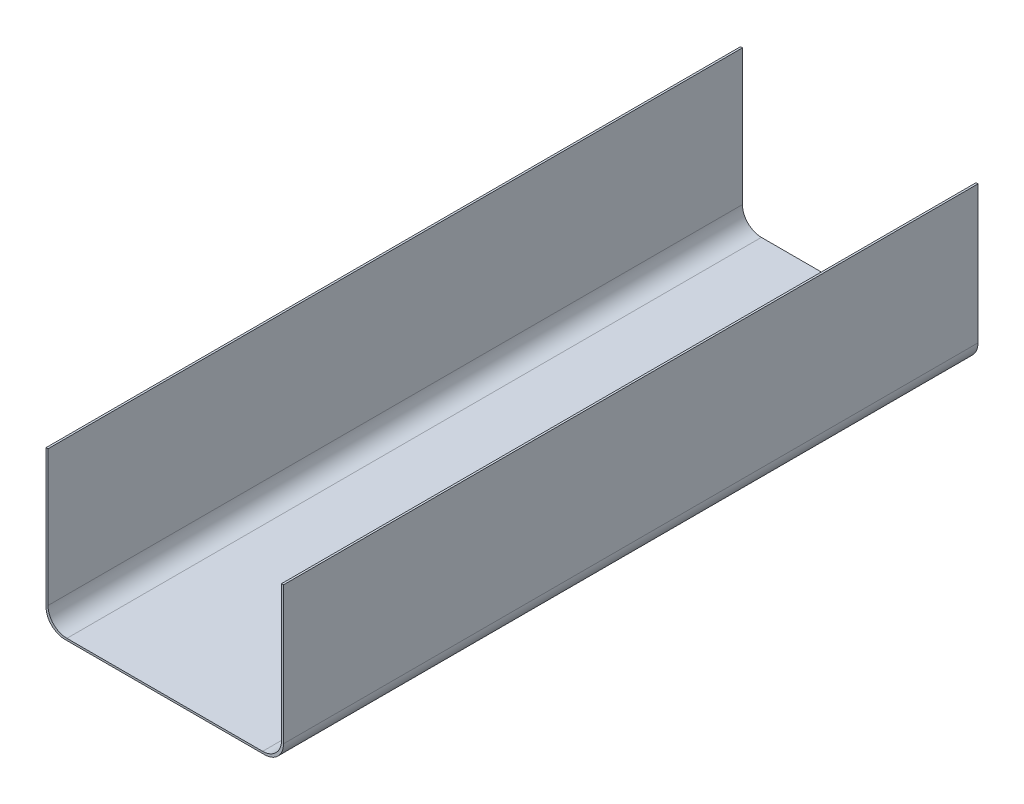
ISO-10303-21;
HEADER;
FILE_DESCRIPTION(('STEP AP214'),'2;1');
FILE_NAME('part.step','',(''),(''),'','','');
FILE_SCHEMA(('AUTOMOTIVE_DESIGN { 1 0 10303 214 1 1 1 1 }'));
ENDSEC;
DATA;
#1=APPLICATION_CONTEXT('core data for automotive mechanical design processes');
#2=APPLICATION_PROTOCOL_DEFINITION('international standard','automotive_design',2000,#1);
#3=PRODUCT_CONTEXT('',#1,'mechanical');
#4=PRODUCT('Part','Part','',(#3));
#5=PRODUCT_RELATED_PRODUCT_CATEGORY('part','',(#4));
#6=PRODUCT_DEFINITION_FORMATION('','',#4);
#7=PRODUCT_DEFINITION_CONTEXT('part definition',#1,'design');
#8=PRODUCT_DEFINITION('design','',#6,#7);
#9=PRODUCT_DEFINITION_SHAPE('','',#8);
#10=(LENGTH_UNIT() NAMED_UNIT(*) SI_UNIT(.MILLI.,.METRE.));
#11=(NAMED_UNIT(*) PLANE_ANGLE_UNIT() SI_UNIT($,.RADIAN.));
#12=(NAMED_UNIT(*) SI_UNIT($,.STERADIAN.) SOLID_ANGLE_UNIT());
#13=UNCERTAINTY_MEASURE_WITH_UNIT(LENGTH_MEASURE(1.E-05),#10,'distance_accuracy_value','');
#14=(GEOMETRIC_REPRESENTATION_CONTEXT(3) GLOBAL_UNCERTAINTY_ASSIGNED_CONTEXT((#13)) GLOBAL_UNIT_ASSIGNED_CONTEXT((#10,
#11,#12)) REPRESENTATION_CONTEXT('',''));
#15=CARTESIAN_POINT('',(0.,0.,0.));
#16=DIRECTION('',(0.,0.,1.));
#17=DIRECTION('',(1.,0.,0.));
#18=AXIS2_PLACEMENT_3D('',#15,#16,#17);
#19=CARTESIAN_POINT('',(-39.3699999999992,-39.3699999999992,279.4));
#20=DIRECTION('',(0.,0.,-1.));
#21=DIRECTION('',(-1.,0.,0.));
#22=AXIS2_PLACEMENT_3D('',#19,#20,#21);
#23=CYLINDRICAL_SURFACE('',#22,7.62);
#24=CARTESIAN_POINT('',(-39.3699999999992,-39.3699999999992,0.));
#25=DIRECTION('',(0.,0.,-1.));
#26=DIRECTION('',(-1.,0.,0.));
#27=AXIS2_PLACEMENT_3D('',#24,#25,#26);
#28=CIRCLE('',#27,7.62);
#29=CARTESIAN_POINT('',(-39.3699999999992,-46.9899999999992,0.));
#30=VERTEX_POINT('',#29);
#31=CARTESIAN_POINT('',(-46.9899999999992,-39.3699999999992,0.));
#32=VERTEX_POINT('',#31);
#33=EDGE_CURVE('E165',#30,#32,#28,.T.);
#34=ORIENTED_EDGE('',*,*,#33,.T.);
#35=DIRECTION('',(0.,0.,-1.));
#36=VECTOR('',#35,1.);
#37=CARTESIAN_POINT('',(-46.9899999999992,-39.3699999999992,279.4));
#38=LINE('',#37,#36);
#39=CARTESIAN_POINT('',(-46.9899999999992,-39.3699999999992,279.4));
#40=VERTEX_POINT('',#39);
#41=EDGE_CURVE('E11',#40,#32,#38,.T.);
#42=ORIENTED_EDGE('',*,*,#41,.F.);
#43=CARTESIAN_POINT('',(-39.3699999999992,-39.3699999999992,279.4));
#44=DIRECTION('',(0.,0.,-1.));
#45=DIRECTION('',(-1.,0.,0.));
#46=AXIS2_PLACEMENT_3D('',#43,#44,#45);
#47=CIRCLE('',#46,7.62);
#48=CARTESIAN_POINT('',(-39.3699999999992,-46.9899999999992,279.4));
#49=VERTEX_POINT('',#48);
#50=EDGE_CURVE('E199',#49,#40,#47,.T.);
#51=ORIENTED_EDGE('',*,*,#50,.F.);
#52=DIRECTION('',(0.,0.,-1.));
#53=VECTOR('',#52,1.);
#54=CARTESIAN_POINT('',(-39.3699999999992,-46.9899999999992,279.4));
#55=LINE('',#54,#53);
#56=EDGE_CURVE('E161',#49,#30,#55,.T.);
#57=ORIENTED_EDGE('',*,*,#56,.T.);
#58=EDGE_LOOP('',(#34,#42,#51,#57));
#59=FACE_BOUND('',#58,.T.);
#60=ADVANCED_FACE('F40',(#59),#23,.F.);
#61=CARTESIAN_POINT('',(-46.9899999999992,15.2400000000008,279.4));
#62=DIRECTION('',(-1.,0.,0.));
#63=DIRECTION('',(0.,0.,1.));
#64=AXIS2_PLACEMENT_3D('',#61,#62,#63);
#65=PLANE('',#64);
#66=DIRECTION('',(0.,1.,0.));
#67=VECTOR('',#66,1.);
#68=CARTESIAN_POINT('',(-46.9899999999992,15.2400000000008,0.));
#69=LINE('',#68,#67);
#70=CARTESIAN_POINT('',(-46.9899999999992,15.2400000000008,0.));
#71=VERTEX_POINT('',#70);
#72=EDGE_CURVE('E169',#32,#71,#69,.T.);
#73=ORIENTED_EDGE('',*,*,#72,.T.);
#74=DIRECTION('',(0.,0.,-1.));
#75=VECTOR('',#74,1.);
#76=CARTESIAN_POINT('',(-46.9899999999992,15.2400000000008,279.4));
#77=LINE('',#76,#75);
#78=CARTESIAN_POINT('',(-46.9899999999992,15.2400000000008,279.4));
#79=VERTEX_POINT('',#78);
#80=EDGE_CURVE('E49',#79,#71,#77,.T.);
#81=ORIENTED_EDGE('',*,*,#80,.F.);
#82=DIRECTION('',(0.,1.,0.));
#83=VECTOR('',#82,1.);
#84=CARTESIAN_POINT('',(-46.9899999999992,15.2400000000008,279.4));
#85=LINE('',#84,#83);
#86=EDGE_CURVE('E112',#40,#79,#85,.T.);
#87=ORIENTED_EDGE('',*,*,#86,.F.);
#88=ORIENTED_EDGE('',*,*,#41,.T.);
#89=EDGE_LOOP('',(#73,#81,#87,#88));
#90=FACE_BOUND('',#89,.T.);
#91=ADVANCED_FACE('F293',(#90),#65,.F.);
#92=CARTESIAN_POINT('',(-46.9899999999992,15.2400000000008,279.4));
#93=DIRECTION('',(0.,-1.,0.));
#94=DIRECTION('',(0.,0.,-1.));
#95=AXIS2_PLACEMENT_3D('',#92,#93,#94);
#96=PLANE('',#95);
#97=DIRECTION('',(-1.,0.,0.));
#98=VECTOR('',#97,1.);
#99=CARTESIAN_POINT('',(-46.9899999999992,15.2400000000008,0.));
#100=LINE('',#99,#98);
#101=CARTESIAN_POINT('',(-47.7837499999992,15.2400000000008,0.));
#102=VERTEX_POINT('',#101);
#103=EDGE_CURVE('E172',#71,#102,#100,.T.);
#104=ORIENTED_EDGE('',*,*,#103,.T.);
#105=DIRECTION('',(0.,0.,-1.));
#106=VECTOR('',#105,1.);
#107=CARTESIAN_POINT('',(-47.7837499999992,15.2400000000008,279.4));
#108=LINE('',#107,#106);
#109=CARTESIAN_POINT('',(-47.7837499999992,15.2400000000008,279.4));
#110=VERTEX_POINT('',#109);
#111=EDGE_CURVE('E226',#110,#102,#108,.T.);
#112=ORIENTED_EDGE('',*,*,#111,.F.);
#113=DIRECTION('',(-1.,0.,0.));
#114=VECTOR('',#113,1.);
#115=CARTESIAN_POINT('',(-46.9899999999992,15.2400000000008,279.4));
#116=LINE('',#115,#114);
#117=EDGE_CURVE('E236',#79,#110,#116,.T.);
#118=ORIENTED_EDGE('',*,*,#117,.F.);
#119=ORIENTED_EDGE('',*,*,#80,.T.);
#120=EDGE_LOOP('',(#104,#112,#118,#119));
#121=FACE_BOUND('',#120,.T.);
#122=ADVANCED_FACE('F234',(#121),#96,.F.);
#123=CARTESIAN_POINT('',(-47.7837499999992,15.2400000000008,279.4));
#124=DIRECTION('',(1.,0.,0.));
#125=DIRECTION('',(0.,0.,-1.));
#126=AXIS2_PLACEMENT_3D('',#123,#124,#125);
#127=PLANE('',#126);
#128=DIRECTION('',(0.,-1.,0.));
#129=VECTOR('',#128,1.);
#130=CARTESIAN_POINT('',(-47.7837499999992,15.2400000000008,0.));
#131=LINE('',#130,#129);
#132=CARTESIAN_POINT('',(-47.7837499999992,-40.1637499999992,0.));
#133=VERTEX_POINT('',#132);
#134=EDGE_CURVE('E175',#102,#133,#131,.T.);
#135=ORIENTED_EDGE('',*,*,#134,.T.);
#136=DIRECTION('',(0.,0.,-1.));
#137=VECTOR('',#136,1.);
#138=CARTESIAN_POINT('',(-47.7837499999992,-40.1637499999992,279.4));
#139=LINE('',#138,#137);
#140=CARTESIAN_POINT('',(-47.7837499999992,-40.1637499999992,279.4));
#141=VERTEX_POINT('',#140);
#142=EDGE_CURVE('E222',#141,#133,#139,.T.);
#143=ORIENTED_EDGE('',*,*,#142,.F.);
#144=DIRECTION('',(0.,-1.,0.));
#145=VECTOR('',#144,1.);
#146=CARTESIAN_POINT('',(-47.7837499999992,15.2400000000008,279.4));
#147=LINE('',#146,#145);
#148=EDGE_CURVE('E255',#110,#141,#147,.T.);
#149=ORIENTED_EDGE('',*,*,#148,.F.);
#150=ORIENTED_EDGE('',*,*,#111,.T.);
#151=EDGE_LOOP('',(#135,#143,#149,#150));
#152=FACE_BOUND('',#151,.T.);
#153=ADVANCED_FACE('F245',(#152),#127,.F.);
#154=CARTESIAN_POINT('',(-40.1637499999992,-40.1637499999992,279.4));
#155=DIRECTION('',(0.,0.,-1.));
#156=DIRECTION('',(-1.,0.,0.));
#157=AXIS2_PLACEMENT_3D('',#154,#155,#156);
#158=CYLINDRICAL_SURFACE('',#157,7.62);
#159=CARTESIAN_POINT('',(-40.1637499999992,-40.1637499999992,0.));
#160=DIRECTION('',(0.,0.,1.));
#161=DIRECTION('',(-1.,0.,0.));
#162=AXIS2_PLACEMENT_3D('',#159,#160,#161);
#163=CIRCLE('',#162,7.62);
#164=CARTESIAN_POINT('',(-40.1637499999992,-47.7837499999992,0.));
#165=VERTEX_POINT('',#164);
#166=EDGE_CURVE('E178',#133,#165,#163,.T.);
#167=ORIENTED_EDGE('',*,*,#166,.T.);
#168=DIRECTION('',(0.,0.,-1.));
#169=VECTOR('',#168,1.);
#170=CARTESIAN_POINT('',(-40.1637499999992,-47.7837499999992,279.4));
#171=LINE('',#170,#169);
#172=CARTESIAN_POINT('',(-40.1637499999992,-47.7837499999992,279.4));
#173=VERTEX_POINT('',#172);
#174=EDGE_CURVE('E218',#173,#165,#171,.T.);
#175=ORIENTED_EDGE('',*,*,#174,.F.);
#176=CARTESIAN_POINT('',(-40.1637499999992,-40.1637499999992,279.4));
#177=DIRECTION('',(0.,0.,1.));
#178=DIRECTION('',(-1.,0.,0.));
#179=AXIS2_PLACEMENT_3D('',#176,#177,#178);
#180=CIRCLE('',#179,7.62);
#181=EDGE_CURVE('E251',#141,#173,#180,.T.);
#182=ORIENTED_EDGE('',*,*,#181,.F.);
#183=ORIENTED_EDGE('',*,*,#142,.T.);
#184=EDGE_LOOP('',(#167,#175,#182,#183));
#185=FACE_BOUND('',#184,.T.);
#186=ADVANCED_FACE('F249',(#185),#158,.T.);
#187=CARTESIAN_POINT('',(-40.1637499999992,-47.7837499999992,279.4));
#188=DIRECTION('',(0.,1.,0.));
#189=DIRECTION('',(0.,0.,1.));
#190=AXIS2_PLACEMENT_3D('',#187,#188,#189);
#191=PLANE('',#190);
#192=DIRECTION('',(1.,0.,0.));
#193=VECTOR('',#192,1.);
#194=CARTESIAN_POINT('',(-40.1637499999992,-47.7837499999992,0.));
#195=LINE('',#194,#193);
#196=CARTESIAN_POINT('',(40.1637500000008,-47.7837499999992,0.));
#197=VERTEX_POINT('',#196);
#198=EDGE_CURVE('E181',#165,#197,#195,.T.);
#199=ORIENTED_EDGE('',*,*,#198,.T.);
#200=DIRECTION('',(0.,0.,-1.));
#201=VECTOR('',#200,1.);
#202=CARTESIAN_POINT('',(40.1637500000008,-47.7837499999992,279.4));
#203=LINE('',#202,#201);
#204=CARTESIAN_POINT('',(40.1637500000008,-47.7837499999992,279.4));
#205=VERTEX_POINT('',#204);
#206=EDGE_CURVE('E214',#205,#197,#203,.T.);
#207=ORIENTED_EDGE('',*,*,#206,.F.);
#208=DIRECTION('',(1.,0.,0.));
#209=VECTOR('',#208,1.);
#210=CARTESIAN_POINT('',(-40.1637499999992,-47.7837499999992,279.4));
#211=LINE('',#210,#209);
#212=EDGE_CURVE('E254',#173,#205,#211,.T.);
#213=ORIENTED_EDGE('',*,*,#212,.F.);
#214=ORIENTED_EDGE('',*,*,#174,.T.);
#215=EDGE_LOOP('',(#199,#207,#213,#214));
#216=FACE_BOUND('',#215,.T.);
#217=ADVANCED_FACE('F306',(#216),#191,.F.);
#218=CARTESIAN_POINT('',(40.1637500000008,-40.1637499999992,279.4));
#219=DIRECTION('',(0.,0.,-1.));
#220=DIRECTION('',(-1.,0.,0.));
#221=AXIS2_PLACEMENT_3D('',#218,#219,#220);
#222=CYLINDRICAL_SURFACE('',#221,7.62000000000001);
#223=CARTESIAN_POINT('',(40.1637500000008,-40.1637499999992,0.));
#224=DIRECTION('',(0.,0.,1.));
#225=DIRECTION('',(-1.,0.,0.));
#226=AXIS2_PLACEMENT_3D('',#223,#224,#225);
#227=CIRCLE('',#226,7.62000000000001);
#228=CARTESIAN_POINT('',(47.7837500000008,-40.1637499999992,0.));
#229=VERTEX_POINT('',#228);
#230=EDGE_CURVE('E184',#197,#229,#227,.T.);
#231=ORIENTED_EDGE('',*,*,#230,.T.);
#232=DIRECTION('',(0.,0.,-1.));
#233=VECTOR('',#232,1.);
#234=CARTESIAN_POINT('',(47.7837500000008,-40.1637499999992,279.4));
#235=LINE('',#234,#233);
#236=CARTESIAN_POINT('',(47.7837500000008,-40.1637499999992,279.4));
#237=VERTEX_POINT('',#236);
#238=EDGE_CURVE('E210',#237,#229,#235,.T.);
#239=ORIENTED_EDGE('',*,*,#238,.F.);
#240=CARTESIAN_POINT('',(40.1637500000008,-40.1637499999992,279.4));
#241=DIRECTION('',(0.,0.,1.));
#242=DIRECTION('',(-1.,0.,0.));
#243=AXIS2_PLACEMENT_3D('',#240,#241,#242);
#244=CIRCLE('',#243,7.62000000000001);
#245=EDGE_CURVE('E259',#205,#237,#244,.T.);
#246=ORIENTED_EDGE('',*,*,#245,.F.);
#247=ORIENTED_EDGE('',*,*,#206,.T.);
#248=EDGE_LOOP('',(#231,#239,#246,#247));
#249=FACE_BOUND('',#248,.T.);
#250=ADVANCED_FACE('F309',(#249),#222,.T.);
#251=CARTESIAN_POINT('',(47.7837500000008,15.2400000000008,279.4));
#252=DIRECTION('',(-1.,0.,0.));
#253=DIRECTION('',(0.,-1.,0.));
#254=AXIS2_PLACEMENT_3D('',#251,#252,#253);
#255=PLANE('',#254);
#256=DIRECTION('',(0.,1.,0.));
#257=VECTOR('',#256,1.);
#258=CARTESIAN_POINT('',(47.7837500000008,15.2400000000008,0.));
#259=LINE('',#258,#257);
#260=CARTESIAN_POINT('',(47.7837500000008,15.2400000000008,0.));
#261=VERTEX_POINT('',#260);
#262=EDGE_CURVE('E187',#229,#261,#259,.T.);
#263=ORIENTED_EDGE('',*,*,#262,.T.);
#264=DIRECTION('',(0.,0.,-1.));
#265=VECTOR('',#264,1.);
#266=CARTESIAN_POINT('',(47.7837500000008,15.2400000000008,279.4));
#267=LINE('',#266,#265);
#268=CARTESIAN_POINT('',(47.7837500000008,15.2400000000008,279.4));
#269=VERTEX_POINT('',#268);
#270=EDGE_CURVE('E206',#269,#261,#267,.T.);
#271=ORIENTED_EDGE('',*,*,#270,.F.);
#272=DIRECTION('',(0.,1.,0.));
#273=VECTOR('',#272,1.);
#274=CARTESIAN_POINT('',(47.7837500000008,15.2400000000008,279.4));
#275=LINE('',#274,#273);
#276=EDGE_CURVE('E266',#237,#269,#275,.T.);
#277=ORIENTED_EDGE('',*,*,#276,.F.);
#278=ORIENTED_EDGE('',*,*,#238,.T.);
#279=EDGE_LOOP('',(#263,#271,#277,#278));
#280=FACE_BOUND('',#279,.T.);
#281=ADVANCED_FACE('F274',(#280),#255,.F.);
#282=CARTESIAN_POINT('',(46.9900000000008,15.2400000000008,279.4));
#283=DIRECTION('',(0.,-1.,0.));
#284=DIRECTION('',(0.,0.,-1.));
#285=AXIS2_PLACEMENT_3D('',#282,#283,#284);
#286=PLANE('',#285);
#287=DIRECTION('',(-1.,0.,0.));
#288=VECTOR('',#287,1.);
#289=CARTESIAN_POINT('',(46.9900000000008,15.2400000000008,0.));
#290=LINE('',#289,#288);
#291=CARTESIAN_POINT('',(46.9900000000008,15.2400000000008,0.));
#292=VERTEX_POINT('',#291);
#293=EDGE_CURVE('E190',#261,#292,#290,.T.);
#294=ORIENTED_EDGE('',*,*,#293,.T.);
#295=DIRECTION('',(0.,0.,-1.));
#296=VECTOR('',#295,1.);
#297=CARTESIAN_POINT('',(46.9900000000008,15.2400000000008,279.4));
#298=LINE('',#297,#296);
#299=CARTESIAN_POINT('',(46.9900000000008,15.2400000000008,279.4));
#300=VERTEX_POINT('',#299);
#301=EDGE_CURVE('E154',#300,#292,#298,.T.);
#302=ORIENTED_EDGE('',*,*,#301,.F.);
#303=DIRECTION('',(-1.,0.,0.));
#304=VECTOR('',#303,1.);
#305=CARTESIAN_POINT('',(46.9900000000008,15.2400000000008,279.4));
#306=LINE('',#305,#304);
#307=EDGE_CURVE('E143',#269,#300,#306,.T.);
#308=ORIENTED_EDGE('',*,*,#307,.F.);
#309=ORIENTED_EDGE('',*,*,#270,.T.);
#310=EDGE_LOOP('',(#294,#302,#308,#309));
#311=FACE_BOUND('',#310,.T.);
#312=ADVANCED_FACE('F278',(#311),#286,.F.);
#313=CARTESIAN_POINT('',(46.9900000000008,15.2400000000008,279.4));
#314=DIRECTION('',(1.,0.,0.));
#315=DIRECTION('',(0.,1.,0.));
#316=AXIS2_PLACEMENT_3D('',#313,#314,#315);
#317=PLANE('',#316);
#318=DIRECTION('',(0.,-1.,0.));
#319=VECTOR('',#318,1.);
#320=CARTESIAN_POINT('',(46.9900000000008,15.2400000000008,0.));
#321=LINE('',#320,#319);
#322=CARTESIAN_POINT('',(46.9900000000008,-39.3699999999992,0.));
#323=VERTEX_POINT('',#322);
#324=EDGE_CURVE('E152',#292,#323,#321,.T.);
#325=ORIENTED_EDGE('',*,*,#324,.T.);
#326=DIRECTION('',(0.,0.,-1.));
#327=VECTOR('',#326,1.);
#328=CARTESIAN_POINT('',(46.9900000000008,-39.3699999999992,279.4));
#329=LINE('',#328,#327);
#330=CARTESIAN_POINT('',(46.9900000000008,-39.3699999999992,279.4));
#331=VERTEX_POINT('',#330);
#332=EDGE_CURVE('E149',#331,#323,#329,.T.);
#333=ORIENTED_EDGE('',*,*,#332,.F.);
#334=DIRECTION('',(0.,-1.,0.));
#335=VECTOR('',#334,1.);
#336=CARTESIAN_POINT('',(46.9900000000008,15.2400000000008,279.4));
#337=LINE('',#336,#335);
#338=EDGE_CURVE('E137',#300,#331,#337,.T.);
#339=ORIENTED_EDGE('',*,*,#338,.F.);
#340=ORIENTED_EDGE('',*,*,#301,.T.);
#341=EDGE_LOOP('',(#325,#333,#339,#340));
#342=FACE_BOUND('',#341,.T.);
#343=ADVANCED_FACE('F150',(#342),#317,.F.);
#344=CARTESIAN_POINT('',(39.3700000000008,-39.3699999999992,279.4));
#345=DIRECTION('',(0.,0.,-1.));
#346=DIRECTION('',(-1.,0.,0.));
#347=AXIS2_PLACEMENT_3D('',#344,#345,#346);
#348=CYLINDRICAL_SURFACE('',#347,7.62);
#349=CARTESIAN_POINT('',(39.3700000000008,-39.3699999999992,0.));
#350=DIRECTION('',(0.,0.,-1.));
#351=DIRECTION('',(-1.,0.,0.));
#352=AXIS2_PLACEMENT_3D('',#349,#350,#351);
#353=CIRCLE('',#352,7.62);
#354=CARTESIAN_POINT('',(39.3700000000008,-46.9899999999992,0.));
#355=VERTEX_POINT('',#354);
#356=EDGE_CURVE('E98',#323,#355,#353,.T.);
#357=ORIENTED_EDGE('',*,*,#356,.T.);
#358=DIRECTION('',(0.,0.,-1.));
#359=VECTOR('',#358,1.);
#360=CARTESIAN_POINT('',(39.3700000000008,-46.9899999999992,279.4));
#361=LINE('',#360,#359);
#362=CARTESIAN_POINT('',(39.3700000000008,-46.9899999999992,279.4));
#363=VERTEX_POINT('',#362);
#364=EDGE_CURVE('E155',#363,#355,#361,.T.);
#365=ORIENTED_EDGE('',*,*,#364,.F.);
#366=CARTESIAN_POINT('',(39.3700000000008,-39.3699999999992,279.4));
#367=DIRECTION('',(0.,0.,-1.));
#368=DIRECTION('',(-1.,0.,0.));
#369=AXIS2_PLACEMENT_3D('',#366,#367,#368);
#370=CIRCLE('',#369,7.62);
#371=EDGE_CURVE('E141',#331,#363,#370,.T.);
#372=ORIENTED_EDGE('',*,*,#371,.F.);
#373=ORIENTED_EDGE('',*,*,#332,.T.);
#374=EDGE_LOOP('',(#357,#365,#372,#373));
#375=FACE_BOUND('',#374,.T.);
#376=ADVANCED_FACE('F157',(#375),#348,.F.);
#377=CARTESIAN_POINT('',(-39.3699999999992,-46.9899999999992,279.4));
#378=DIRECTION('',(0.,-1.,0.));
#379=DIRECTION('',(1.,0.,0.));
#380=AXIS2_PLACEMENT_3D('',#377,#378,#379);
#381=PLANE('',#380);
#382=DIRECTION('',(-1.,0.,0.));
#383=VECTOR('',#382,1.);
#384=CARTESIAN_POINT('',(-39.3699999999992,-46.9899999999992,0.));
#385=LINE('',#384,#383);
#386=EDGE_CURVE('E104',#355,#30,#385,.T.);
#387=ORIENTED_EDGE('',*,*,#386,.T.);
#388=ORIENTED_EDGE('',*,*,#56,.F.);
#389=DIRECTION('',(-1.,0.,0.));
#390=VECTOR('',#389,1.);
#391=CARTESIAN_POINT('',(-39.3699999999992,-46.9899999999992,279.4));
#392=LINE('',#391,#390);
#393=EDGE_CURVE('E57',#363,#49,#392,.T.);
#394=ORIENTED_EDGE('',*,*,#393,.F.);
#395=ORIENTED_EDGE('',*,*,#364,.T.);
#396=EDGE_LOOP('',(#387,#388,#394,#395));
#397=FACE_BOUND('',#396,.T.);
#398=ADVANCED_FACE('F282',(#397),#381,.F.);
#399=CARTESIAN_POINT('',(-39.3699999999992,-39.3699999999992,279.4));
#400=DIRECTION('',(0.,0.,-1.));
#401=DIRECTION('',(-1.,0.,0.));
#402=AXIS2_PLACEMENT_3D('',#399,#400,#401);
#403=PLANE('',#402);
#404=ORIENTED_EDGE('',*,*,#50,.T.);
#405=ORIENTED_EDGE('',*,*,#86,.T.);
#406=ORIENTED_EDGE('',*,*,#117,.T.);
#407=ORIENTED_EDGE('',*,*,#148,.T.);
#408=ORIENTED_EDGE('',*,*,#181,.T.);
#409=ORIENTED_EDGE('',*,*,#212,.T.);
#410=ORIENTED_EDGE('',*,*,#245,.T.);
#411=ORIENTED_EDGE('',*,*,#276,.T.);
#412=ORIENTED_EDGE('',*,*,#307,.T.);
#413=ORIENTED_EDGE('',*,*,#338,.T.);
#414=ORIENTED_EDGE('',*,*,#371,.T.);
#415=ORIENTED_EDGE('',*,*,#393,.T.);
#416=EDGE_LOOP('',(#404,#405,#406,#407,#408,#409,#410,#411,#412,#413,#414,#415));
#417=FACE_BOUND('',#416,.T.);
#418=ADVANCED_FACE('F139',(#417),#403,.F.);
#419=CARTESIAN_POINT('',(-39.3699999999992,-39.3699999999992,0.));
#420=DIRECTION('',(0.,0.,-1.));
#421=DIRECTION('',(-1.,0.,0.));
#422=AXIS2_PLACEMENT_3D('',#419,#420,#421);
#423=PLANE('',#422);
#424=ORIENTED_EDGE('',*,*,#33,.F.);
#425=ORIENTED_EDGE('',*,*,#386,.F.);
#426=ORIENTED_EDGE('',*,*,#356,.F.);
#427=ORIENTED_EDGE('',*,*,#324,.F.);
#428=ORIENTED_EDGE('',*,*,#293,.F.);
#429=ORIENTED_EDGE('',*,*,#262,.F.);
#430=ORIENTED_EDGE('',*,*,#230,.F.);
#431=ORIENTED_EDGE('',*,*,#198,.F.);
#432=ORIENTED_EDGE('',*,*,#166,.F.);
#433=ORIENTED_EDGE('',*,*,#134,.F.);
#434=ORIENTED_EDGE('',*,*,#103,.F.);
#435=ORIENTED_EDGE('',*,*,#72,.F.);
#436=EDGE_LOOP('',(#424,#425,#426,#427,#428,#429,#430,#431,#432,#433,#434,#435));
#437=FACE_BOUND('',#436,.T.);
#438=ADVANCED_FACE('F240',(#437),#423,.T.);
#439=CLOSED_SHELL('',(#60,#91,#122,#153,#186,#217,#250,#281,#312,#343,#376,#398,#418,#438));
#440=MANIFOLD_SOLID_BREP('B2',#439);
#441=ADVANCED_BREP_SHAPE_REPRESENTATION('',(#18,#440),#14);
#442=SHAPE_DEFINITION_REPRESENTATION(#9,#441);
ENDSEC;
END-ISO-10303-21;
